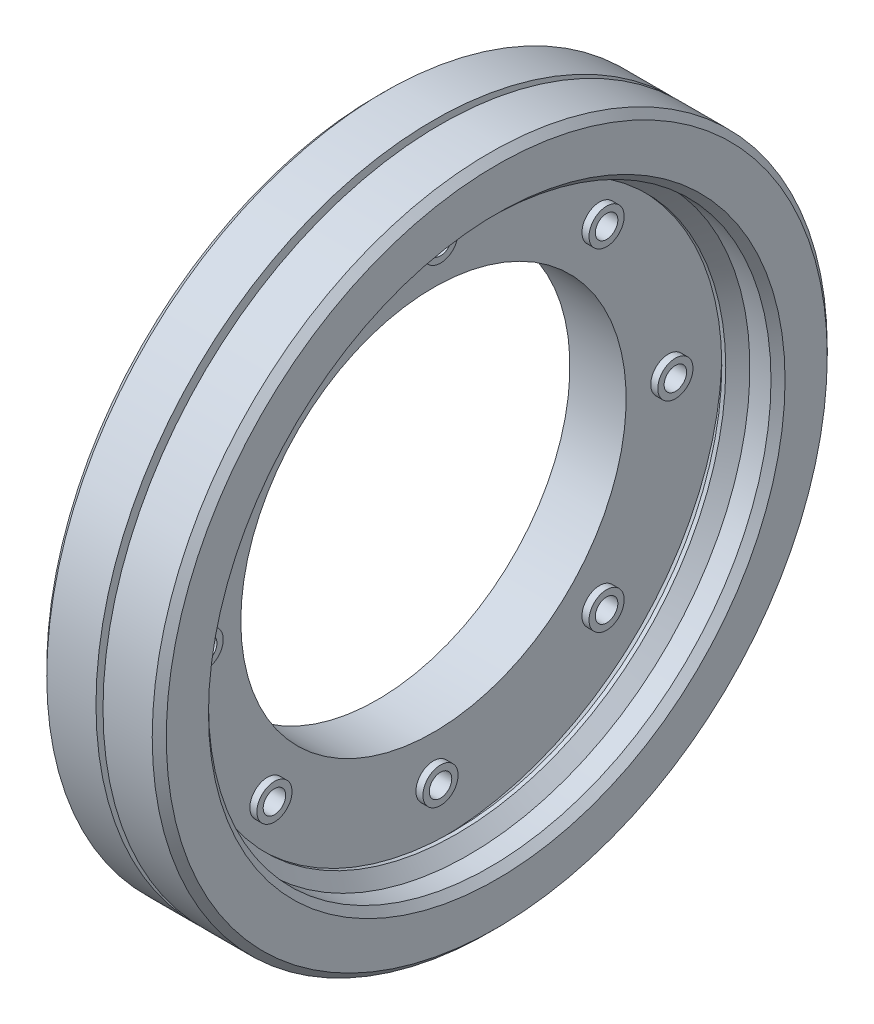
ISO-10303-21;
HEADER;
FILE_DESCRIPTION(('STEP AP214'),'2;1');
FILE_NAME('part.step','',(''),(''),'','','');
FILE_SCHEMA(('AUTOMOTIVE_DESIGN { 1 0 10303 214 1 1 1 1 }'));
ENDSEC;
DATA;
#1=APPLICATION_CONTEXT('core data for automotive mechanical design processes');
#2=APPLICATION_PROTOCOL_DEFINITION('international standard','automotive_design',2000,#1);
#3=PRODUCT_CONTEXT('',#1,'mechanical');
#4=PRODUCT('Part','Part','',(#3));
#5=PRODUCT_RELATED_PRODUCT_CATEGORY('part','',(#4));
#6=PRODUCT_DEFINITION_FORMATION('','',#4);
#7=PRODUCT_DEFINITION_CONTEXT('part definition',#1,'design');
#8=PRODUCT_DEFINITION('design','',#6,#7);
#9=PRODUCT_DEFINITION_SHAPE('','',#8);
#10=(LENGTH_UNIT() NAMED_UNIT(*) SI_UNIT(.MILLI.,.METRE.));
#11=(NAMED_UNIT(*) PLANE_ANGLE_UNIT() SI_UNIT($,.RADIAN.));
#12=(NAMED_UNIT(*) SI_UNIT($,.STERADIAN.) SOLID_ANGLE_UNIT());
#13=UNCERTAINTY_MEASURE_WITH_UNIT(LENGTH_MEASURE(1.E-05),#10,'distance_accuracy_value','');
#14=(GEOMETRIC_REPRESENTATION_CONTEXT(3) GLOBAL_UNCERTAINTY_ASSIGNED_CONTEXT((#13)) GLOBAL_UNIT_ASSIGNED_CONTEXT((#10,
#11,#12)) REPRESENTATION_CONTEXT('',''));
#15=CARTESIAN_POINT('',(0.,0.,0.));
#16=DIRECTION('',(0.,0.,1.));
#17=DIRECTION('',(1.,0.,0.));
#18=AXIS2_PLACEMENT_3D('',#15,#16,#17);
#19=CARTESIAN_POINT('',(-0.999999999999999,0.,0.));
#20=DIRECTION('',(1.,0.,0.));
#21=DIRECTION('',(0.,0.,-1.));
#22=AXIS2_PLACEMENT_3D('',#19,#20,#21);
#23=PLANE('',#22);
#24=CARTESIAN_POINT('',(-0.999999999999999,33.4,-3.49846430152082E-13));
#25=DIRECTION('',(1.,0.,0.));
#26=DIRECTION('',(0.,1.,0.));
#27=AXIS2_PLACEMENT_3D('',#24,#25,#26);
#28=CIRCLE('',#27,2.5);
#29=CARTESIAN_POINT('',(-0.999999999999999,35.9,-3.76032540193405E-13));
#30=VERTEX_POINT('',#29);
#31=EDGE_CURVE('E144',#30,#30,#28,.T.);
#32=ORIENTED_EDGE('',*,*,#31,.F.);
#33=EDGE_LOOP('',(#32));
#34=FACE_BOUND('',#33,.T.);
#35=CARTESIAN_POINT('',(-0.999999999999999,0.,33.4));
#36=DIRECTION('',(1.,0.,0.));
#37=DIRECTION('',(0.,0.,1.));
#38=AXIS2_PLACEMENT_3D('',#35,#36,#37);
#39=CIRCLE('',#38,2.5);
#40=CARTESIAN_POINT('',(-0.999999999999999,0.,35.9));
#41=VERTEX_POINT('',#40);
#42=EDGE_CURVE('E126',#41,#41,#39,.T.);
#43=ORIENTED_EDGE('',*,*,#42,.F.);
#44=EDGE_LOOP('',(#43));
#45=FACE_BOUND('',#44,.T.);
#46=CARTESIAN_POINT('',(-0.999999999999999,-33.4,1.16615476717361E-13));
#47=DIRECTION('',(1.,0.,0.));
#48=DIRECTION('',(0.,-1.,0.));
#49=AXIS2_PLACEMENT_3D('',#46,#47,#48);
#50=CIRCLE('',#49,2.5);
#51=CARTESIAN_POINT('',(-0.999999999999999,-35.9,1.25344180064468E-13));
#52=VERTEX_POINT('',#51);
#53=EDGE_CURVE('E108',#52,#52,#50,.T.);
#54=ORIENTED_EDGE('',*,*,#53,.F.);
#55=EDGE_LOOP('',(#54));
#56=FACE_BOUND('',#55,.T.);
#57=CARTESIAN_POINT('',(-0.999999999999999,0.,-33.4));
#58=DIRECTION('',(1.,0.,0.));
#59=DIRECTION('',(0.,0.,-1.));
#60=AXIS2_PLACEMENT_3D('',#57,#58,#59);
#61=CIRCLE('',#60,2.5);
#62=CARTESIAN_POINT('',(-0.999999999999999,0.,-35.9));
#63=VERTEX_POINT('',#62);
#64=EDGE_CURVE('E92',#63,#63,#61,.T.);
#65=ORIENTED_EDGE('',*,*,#64,.F.);
#66=EDGE_LOOP('',(#65));
#67=FACE_BOUND('',#66,.T.);
#68=CARTESIAN_POINT('',(-0.999999999999997,0.,0.));
#69=DIRECTION('',(-1.,0.,0.));
#70=DIRECTION('',(0.,0.,1.));
#71=AXIS2_PLACEMENT_3D('',#68,#69,#70);
#72=CIRCLE('',#71,27.4);
#73=CARTESIAN_POINT('',(-0.999999999999997,0.,27.4));
#74=VERTEX_POINT('',#73);
#75=EDGE_CURVE('E57',#74,#74,#72,.T.);
#76=ORIENTED_EDGE('',*,*,#75,.T.);
#77=EDGE_LOOP('',(#76));
#78=FACE_BOUND('',#77,.T.);
#79=CARTESIAN_POINT('',(-1.,0.,0.));
#80=DIRECTION('',(-1.,0.,0.));
#81=DIRECTION('',(0.,0.,1.));
#82=AXIS2_PLACEMENT_3D('',#79,#80,#81);
#83=CIRCLE('',#82,48.);
#84=CARTESIAN_POINT('',(-1.,0.,48.));
#85=VERTEX_POINT('',#84);
#86=EDGE_CURVE('E85',#85,#85,#83,.T.);
#87=ORIENTED_EDGE('',*,*,#86,.F.);
#88=EDGE_LOOP('',(#87));
#89=FACE_BOUND('',#88,.T.);
#90=CARTESIAN_POINT('',(-0.999999999999999,-23.6173664916307,-23.6173664916306));
#91=DIRECTION('',(1.,0.,0.));
#92=DIRECTION('',(0.,-0.707106781186549,-0.707106781186546));
#93=AXIS2_PLACEMENT_3D('',#90,#91,#92);
#94=CIRCLE('',#93,2.5);
#95=CARTESIAN_POINT('',(-0.999999999999999,-25.3851334445971,-25.385133444597));
#96=VERTEX_POINT('',#95);
#97=EDGE_CURVE('E99',#96,#96,#94,.T.);
#98=ORIENTED_EDGE('',*,*,#97,.F.);
#99=EDGE_LOOP('',(#98));
#100=FACE_BOUND('',#99,.T.);
#101=CARTESIAN_POINT('',(-0.999999999999999,-23.6173664916306,23.6173664916308));
#102=DIRECTION('',(1.,0.,0.));
#103=DIRECTION('',(0.,-0.707106781186544,0.707106781186551));
#104=AXIS2_PLACEMENT_3D('',#101,#102,#103);
#105=CIRCLE('',#104,2.5);
#106=CARTESIAN_POINT('',(-0.999999999999999,-25.3851334445969,25.3851334445972));
#107=VERTEX_POINT('',#106);
#108=EDGE_CURVE('E117',#107,#107,#105,.T.);
#109=ORIENTED_EDGE('',*,*,#108,.F.);
#110=EDGE_LOOP('',(#109));
#111=FACE_BOUND('',#110,.T.);
#112=CARTESIAN_POINT('',(-0.999999999999999,23.6173664916309,23.6173664916305));
#113=DIRECTION('',(1.,0.,0.));
#114=DIRECTION('',(0.,0.707106781186554,0.707106781186541));
#115=AXIS2_PLACEMENT_3D('',#112,#113,#114);
#116=CIRCLE('',#115,2.5);
#117=CARTESIAN_POINT('',(-0.999999999999999,25.3851334445973,25.3851334445968));
#118=VERTEX_POINT('',#117);
#119=EDGE_CURVE('E135',#118,#118,#116,.T.);
#120=ORIENTED_EDGE('',*,*,#119,.F.);
#121=EDGE_LOOP('',(#120));
#122=FACE_BOUND('',#121,.T.);
#123=CARTESIAN_POINT('',(-0.999999999999999,23.6173664916304,-23.617366491631));
#124=DIRECTION('',(1.,0.,0.));
#125=DIRECTION('',(0.,0.707106781186539,-0.707106781186556));
#126=AXIS2_PLACEMENT_3D('',#123,#124,#125);
#127=CIRCLE('',#126,2.5);
#128=CARTESIAN_POINT('',(-0.999999999999999,25.3851334445968,-25.3851334445974));
#129=VERTEX_POINT('',#128);
#130=EDGE_CURVE('E153',#129,#129,#127,.T.);
#131=ORIENTED_EDGE('',*,*,#130,.F.);
#132=EDGE_LOOP('',(#131));
#133=FACE_BOUND('',#132,.T.);
#134=ADVANCED_FACE('F42',(#34,#45,#56,#67,#78,#89,#100,#111,#122,#133),#23,.T.);
#135=CARTESIAN_POINT('',(0.,0.,0.));
#136=DIRECTION('',(-1.,0.,0.));
#137=DIRECTION('',(0.,0.,1.));
#138=AXIS2_PLACEMENT_3D('',#135,#136,#137);
#139=CYLINDRICAL_SURFACE('',#138,48.);
#140=CARTESIAN_POINT('',(-7.99999999999998,0.,0.));
#141=DIRECTION('',(1.,0.,0.));
#142=DIRECTION('',(0.,0.,-1.));
#143=AXIS2_PLACEMENT_3D('',#140,#141,#142);
#144=CIRCLE('',#143,48.);
#145=CARTESIAN_POINT('',(-7.99999999999998,0.,-48.));
#146=VERTEX_POINT('',#145);
#147=EDGE_CURVE('E11',#146,#146,#144,.T.);
#148=ORIENTED_EDGE('',*,*,#147,.T.);
#149=EDGE_LOOP('',(#148));
#150=FACE_BOUND('',#149,.T.);
#151=ORIENTED_EDGE('',*,*,#86,.T.);
#152=EDGE_LOOP('',(#151));
#153=FACE_BOUND('',#152,.T.);
#154=ADVANCED_FACE('F180',(#150,#153),#139,.T.);
#155=CARTESIAN_POINT('',(-9.,0.,0.));
#156=DIRECTION('',(1.,0.,0.));
#157=DIRECTION('',(0.,0.,-1.));
#158=AXIS2_PLACEMENT_3D('',#155,#156,#157);
#159=PLANE('',#158);
#160=CARTESIAN_POINT('',(-9.,0.,0.));
#161=DIRECTION('',(1.,0.,0.));
#162=DIRECTION('',(0.,0.,-1.));
#163=AXIS2_PLACEMENT_3D('',#160,#161,#162);
#164=CIRCLE('',#163,47.);
#165=CARTESIAN_POINT('',(-9.,0.,-47.));
#166=VERTEX_POINT('',#165);
#167=EDGE_CURVE('E49',#166,#166,#164,.F.);
#168=ORIENTED_EDGE('',*,*,#167,.T.);
#169=EDGE_LOOP('',(#168));
#170=FACE_BOUND('',#169,.T.);
#171=CARTESIAN_POINT('',(-9.,-33.4,1.16615476717361E-13));
#172=DIRECTION('',(1.,0.,0.));
#173=DIRECTION('',(0.,0.,-1.));
#174=AXIS2_PLACEMENT_3D('',#171,#172,#173);
#175=CIRCLE('',#174,1.6);
#176=CARTESIAN_POINT('',(-9.,-33.4,-1.59999999999988));
#177=VERTEX_POINT('',#176);
#178=EDGE_CURVE('E60',#177,#177,#175,.T.);
#179=ORIENTED_EDGE('',*,*,#178,.T.);
#180=EDGE_LOOP('',(#179));
#181=FACE_BOUND('',#180,.T.);
#182=CARTESIAN_POINT('',(-9.,-23.6173664916306,23.6173664916308));
#183=DIRECTION('',(1.,0.,0.));
#184=DIRECTION('',(0.,0.,-1.));
#185=AXIS2_PLACEMENT_3D('',#182,#183,#184);
#186=CIRCLE('',#185,1.6);
#187=CARTESIAN_POINT('',(-9.,-23.6173664916306,22.0173664916308));
#188=VERTEX_POINT('',#187);
#189=EDGE_CURVE('E64',#188,#188,#186,.T.);
#190=ORIENTED_EDGE('',*,*,#189,.T.);
#191=EDGE_LOOP('',(#190));
#192=FACE_BOUND('',#191,.T.);
#193=CARTESIAN_POINT('',(-9.,0.,33.4));
#194=DIRECTION('',(1.,0.,0.));
#195=DIRECTION('',(0.,0.,-1.));
#196=AXIS2_PLACEMENT_3D('',#193,#194,#195);
#197=CIRCLE('',#196,1.6);
#198=CARTESIAN_POINT('',(-9.,0.,31.8));
#199=VERTEX_POINT('',#198);
#200=EDGE_CURVE('E67',#199,#199,#197,.T.);
#201=ORIENTED_EDGE('',*,*,#200,.T.);
#202=EDGE_LOOP('',(#201));
#203=FACE_BOUND('',#202,.T.);
#204=CARTESIAN_POINT('',(-9.,23.6173664916309,23.6173664916305));
#205=DIRECTION('',(1.,0.,0.));
#206=DIRECTION('',(0.,0.,-1.));
#207=AXIS2_PLACEMENT_3D('',#204,#205,#206);
#208=CIRCLE('',#207,1.6);
#209=CARTESIAN_POINT('',(-9.,23.6173664916309,22.0173664916305));
#210=VERTEX_POINT('',#209);
#211=EDGE_CURVE('E70',#210,#210,#208,.T.);
#212=ORIENTED_EDGE('',*,*,#211,.T.);
#213=EDGE_LOOP('',(#212));
#214=FACE_BOUND('',#213,.T.);
#215=CARTESIAN_POINT('',(-9.,33.4,-3.49846430152082E-13));
#216=DIRECTION('',(1.,0.,0.));
#217=DIRECTION('',(0.,0.,-1.));
#218=AXIS2_PLACEMENT_3D('',#215,#216,#217);
#219=CIRCLE('',#218,1.6);
#220=CARTESIAN_POINT('',(-9.,33.4,-1.60000000000035));
#221=VERTEX_POINT('',#220);
#222=EDGE_CURVE('E73',#221,#221,#219,.T.);
#223=ORIENTED_EDGE('',*,*,#222,.T.);
#224=EDGE_LOOP('',(#223));
#225=FACE_BOUND('',#224,.T.);
#226=CARTESIAN_POINT('',(-9.,23.6173664916304,-23.617366491631));
#227=DIRECTION('',(1.,0.,0.));
#228=DIRECTION('',(0.,0.,-1.));
#229=AXIS2_PLACEMENT_3D('',#226,#227,#228);
#230=CIRCLE('',#229,1.6);
#231=CARTESIAN_POINT('',(-9.,23.6173664916304,-25.217366491631));
#232=VERTEX_POINT('',#231);
#233=EDGE_CURVE('E76',#232,#232,#230,.T.);
#234=ORIENTED_EDGE('',*,*,#233,.T.);
#235=EDGE_LOOP('',(#234));
#236=FACE_BOUND('',#235,.T.);
#237=CARTESIAN_POINT('',(-9.,-23.6173664916307,-23.6173664916306));
#238=DIRECTION('',(1.,0.,0.));
#239=DIRECTION('',(0.,0.,-1.));
#240=AXIS2_PLACEMENT_3D('',#237,#238,#239);
#241=CIRCLE('',#240,1.6);
#242=CARTESIAN_POINT('',(-9.,-23.6173664916307,-25.2173664916306));
#243=VERTEX_POINT('',#242);
#244=EDGE_CURVE('E79',#243,#243,#241,.T.);
#245=ORIENTED_EDGE('',*,*,#244,.T.);
#246=EDGE_LOOP('',(#245));
#247=FACE_BOUND('',#246,.T.);
#248=CARTESIAN_POINT('',(-9.,0.,-33.4));
#249=DIRECTION('',(1.,0.,0.));
#250=DIRECTION('',(0.,0.,-1.));
#251=AXIS2_PLACEMENT_3D('',#248,#249,#250);
#252=CIRCLE('',#251,1.6);
#253=CARTESIAN_POINT('',(-9.,0.,-35.));
#254=VERTEX_POINT('',#253);
#255=EDGE_CURVE('E88',#254,#254,#252,.T.);
#256=ORIENTED_EDGE('',*,*,#255,.T.);
#257=EDGE_LOOP('',(#256));
#258=FACE_BOUND('',#257,.T.);
#259=CARTESIAN_POINT('',(-9.,0.,0.));
#260=DIRECTION('',(-1.,0.,0.));
#261=DIRECTION('',(0.,0.,1.));
#262=AXIS2_PLACEMENT_3D('',#259,#260,#261);
#263=CIRCLE('',#262,27.4);
#264=CARTESIAN_POINT('',(-9.,0.,27.4));
#265=VERTEX_POINT('',#264);
#266=EDGE_CURVE('E53',#265,#265,#263,.T.);
#267=ORIENTED_EDGE('',*,*,#266,.F.);
#268=EDGE_LOOP('',(#267));
#269=FACE_BOUND('',#268,.T.);
#270=ADVANCED_FACE('F186',(#170,#181,#192,#203,#214,#225,#236,#247,#258,#269),#159,.F.);
#271=CARTESIAN_POINT('',(0.,0.,0.));
#272=DIRECTION('',(-1.,0.,0.));
#273=DIRECTION('',(0.,0.,1.));
#274=AXIS2_PLACEMENT_3D('',#271,#272,#273);
#275=CYLINDRICAL_SURFACE('',#274,27.4);
#276=ORIENTED_EDGE('',*,*,#266,.T.);
#277=EDGE_LOOP('',(#276));
#278=FACE_BOUND('',#277,.T.);
#279=ORIENTED_EDGE('',*,*,#75,.F.);
#280=EDGE_LOOP('',(#279));
#281=FACE_BOUND('',#280,.T.);
#282=ADVANCED_FACE('F193',(#278,#281),#275,.F.);
#283=CARTESIAN_POINT('',(-11.,0.,-33.4));
#284=DIRECTION('',(1.,0.,0.));
#285=DIRECTION('',(0.,0.,-1.));
#286=AXIS2_PLACEMENT_3D('',#283,#284,#285);
#287=CYLINDRICAL_SURFACE('',#286,1.6);
#288=ORIENTED_EDGE('',*,*,#255,.F.);
#289=EDGE_LOOP('',(#288));
#290=FACE_BOUND('',#289,.T.);
#291=CARTESIAN_POINT('',(0.,0.,-33.4));
#292=DIRECTION('',(1.,0.,0.));
#293=DIRECTION('',(0.,0.,-1.));
#294=AXIS2_PLACEMENT_3D('',#291,#292,#293);
#295=CIRCLE('',#294,1.6);
#296=CARTESIAN_POINT('',(0.,0.,-35.));
#297=VERTEX_POINT('',#296);
#298=EDGE_CURVE('E63',#297,#297,#295,.T.);
#299=ORIENTED_EDGE('',*,*,#298,.T.);
#300=EDGE_LOOP('',(#299));
#301=FACE_BOUND('',#300,.T.);
#302=ADVANCED_FACE('F191',(#290,#301),#287,.F.);
#303=CARTESIAN_POINT('',(0.,0.,-33.4));
#304=DIRECTION('',(1.,0.,0.));
#305=DIRECTION('',(0.,0.,-1.));
#306=AXIS2_PLACEMENT_3D('',#303,#304,#305);
#307=PLANE('',#306);
#308=CARTESIAN_POINT('',(0.,0.,-33.4));
#309=DIRECTION('',(1.,0.,0.));
#310=DIRECTION('',(0.,0.,-1.));
#311=AXIS2_PLACEMENT_3D('',#308,#309,#310);
#312=CIRCLE('',#311,2.5);
#313=CARTESIAN_POINT('',(0.,0.,-35.9));
#314=VERTEX_POINT('',#313);
#315=EDGE_CURVE('E91',#314,#314,#312,.T.);
#316=ORIENTED_EDGE('',*,*,#315,.T.);
#317=EDGE_LOOP('',(#316));
#318=FACE_BOUND('',#317,.T.);
#319=ORIENTED_EDGE('',*,*,#298,.F.);
#320=EDGE_LOOP('',(#319));
#321=FACE_BOUND('',#320,.T.);
#322=ADVANCED_FACE('F308',(#318,#321),#307,.T.);
#323=CARTESIAN_POINT('',(0.,0.,-33.4));
#324=DIRECTION('',(-1.,0.,0.));
#325=DIRECTION('',(0.,0.,1.));
#326=AXIS2_PLACEMENT_3D('',#323,#324,#325);
#327=CYLINDRICAL_SURFACE('',#326,2.5);
#328=ORIENTED_EDGE('',*,*,#315,.F.);
#329=EDGE_LOOP('',(#328));
#330=FACE_BOUND('',#329,.T.);
#331=ORIENTED_EDGE('',*,*,#64,.T.);
#332=EDGE_LOOP('',(#331));
#333=FACE_BOUND('',#332,.T.);
#334=ADVANCED_FACE('F306',(#330,#333),#327,.T.);
#335=CARTESIAN_POINT('',(-11.,-23.6173664916307,-23.6173664916306));
#336=DIRECTION('',(1.,0.,0.));
#337=DIRECTION('',(0.,0.,-1.));
#338=AXIS2_PLACEMENT_3D('',#335,#336,#337);
#339=CYLINDRICAL_SURFACE('',#338,1.6);
#340=ORIENTED_EDGE('',*,*,#244,.F.);
#341=EDGE_LOOP('',(#340));
#342=FACE_BOUND('',#341,.T.);
#343=CARTESIAN_POINT('',(0.,-23.6173664916307,-23.6173664916306));
#344=DIRECTION('',(1.,0.,0.));
#345=DIRECTION('',(0.,-0.707106781186549,-0.707106781186546));
#346=AXIS2_PLACEMENT_3D('',#343,#344,#345);
#347=CIRCLE('',#346,1.6);
#348=CARTESIAN_POINT('',(0.,-24.7487373415292,-24.7487373415291));
#349=VERTEX_POINT('',#348);
#350=EDGE_CURVE('E102',#349,#349,#347,.T.);
#351=ORIENTED_EDGE('',*,*,#350,.T.);
#352=EDGE_LOOP('',(#351));
#353=FACE_BOUND('',#352,.T.);
#354=ADVANCED_FACE('F288',(#342,#353),#339,.F.);
#355=CARTESIAN_POINT('',(-11.,23.6173664916304,-23.617366491631));
#356=DIRECTION('',(1.,0.,0.));
#357=DIRECTION('',(0.,0.,-1.));
#358=AXIS2_PLACEMENT_3D('',#355,#356,#357);
#359=CYLINDRICAL_SURFACE('',#358,1.6);
#360=ORIENTED_EDGE('',*,*,#233,.F.);
#361=EDGE_LOOP('',(#360));
#362=FACE_BOUND('',#361,.T.);
#363=CARTESIAN_POINT('',(0.,23.6173664916304,-23.617366491631));
#364=DIRECTION('',(1.,0.,0.));
#365=DIRECTION('',(0.,0.707106781186539,-0.707106781186556));
#366=AXIS2_PLACEMENT_3D('',#363,#364,#365);
#367=CIRCLE('',#366,1.6);
#368=CARTESIAN_POINT('',(0.,24.7487373415289,-24.7487373415295));
#369=VERTEX_POINT('',#368);
#370=EDGE_CURVE('E156',#369,#369,#367,.T.);
#371=ORIENTED_EDGE('',*,*,#370,.T.);
#372=EDGE_LOOP('',(#371));
#373=FACE_BOUND('',#372,.T.);
#374=ADVANCED_FACE('F162',(#362,#373),#359,.F.);
#375=CARTESIAN_POINT('',(-11.,33.4,-3.49846430152082E-13));
#376=DIRECTION('',(1.,0.,0.));
#377=DIRECTION('',(0.,0.,-1.));
#378=AXIS2_PLACEMENT_3D('',#375,#376,#377);
#379=CYLINDRICAL_SURFACE('',#378,1.6);
#380=ORIENTED_EDGE('',*,*,#222,.F.);
#381=EDGE_LOOP('',(#380));
#382=FACE_BOUND('',#381,.T.);
#383=CARTESIAN_POINT('',(0.,33.4,-3.49846430152082E-13));
#384=DIRECTION('',(1.,0.,0.));
#385=DIRECTION('',(0.,1.,0.));
#386=AXIS2_PLACEMENT_3D('',#383,#384,#385);
#387=CIRCLE('',#386,1.6);
#388=CARTESIAN_POINT('',(0.,35.,-3.66605540578529E-13));
#389=VERTEX_POINT('',#388);
#390=EDGE_CURVE('E147',#389,#389,#387,.T.);
#391=ORIENTED_EDGE('',*,*,#390,.T.);
#392=EDGE_LOOP('',(#391));
#393=FACE_BOUND('',#392,.T.);
#394=ADVANCED_FACE('F281',(#382,#393),#379,.F.);
#395=CARTESIAN_POINT('',(-11.,23.6173664916309,23.6173664916305));
#396=DIRECTION('',(1.,0.,0.));
#397=DIRECTION('',(0.,0.,-1.));
#398=AXIS2_PLACEMENT_3D('',#395,#396,#397);
#399=CYLINDRICAL_SURFACE('',#398,1.6);
#400=ORIENTED_EDGE('',*,*,#211,.F.);
#401=EDGE_LOOP('',(#400));
#402=FACE_BOUND('',#401,.T.);
#403=CARTESIAN_POINT('',(0.,23.6173664916309,23.6173664916305));
#404=DIRECTION('',(1.,0.,0.));
#405=DIRECTION('',(0.,0.707106781186554,0.707106781186541));
#406=AXIS2_PLACEMENT_3D('',#403,#404,#405);
#407=CIRCLE('',#406,1.6);
#408=CARTESIAN_POINT('',(0.,24.7487373415294,24.7487373415289));
#409=VERTEX_POINT('',#408);
#410=EDGE_CURVE('E138',#409,#409,#407,.T.);
#411=ORIENTED_EDGE('',*,*,#410,.T.);
#412=EDGE_LOOP('',(#411));
#413=FACE_BOUND('',#412,.T.);
#414=ADVANCED_FACE('F284',(#402,#413),#399,.F.);
#415=CARTESIAN_POINT('',(-11.,0.,33.4));
#416=DIRECTION('',(1.,0.,0.));
#417=DIRECTION('',(0.,0.,-1.));
#418=AXIS2_PLACEMENT_3D('',#415,#416,#417);
#419=CYLINDRICAL_SURFACE('',#418,1.6);
#420=ORIENTED_EDGE('',*,*,#200,.F.);
#421=EDGE_LOOP('',(#420));
#422=FACE_BOUND('',#421,.T.);
#423=CARTESIAN_POINT('',(0.,0.,33.4));
#424=DIRECTION('',(1.,0.,0.));
#425=DIRECTION('',(0.,0.,1.));
#426=AXIS2_PLACEMENT_3D('',#423,#424,#425);
#427=CIRCLE('',#426,1.6);
#428=CARTESIAN_POINT('',(0.,0.,35.));
#429=VERTEX_POINT('',#428);
#430=EDGE_CURVE('E129',#429,#429,#427,.T.);
#431=ORIENTED_EDGE('',*,*,#430,.T.);
#432=EDGE_LOOP('',(#431));
#433=FACE_BOUND('',#432,.T.);
#434=ADVANCED_FACE('F296',(#422,#433),#419,.F.);
#435=CARTESIAN_POINT('',(-11.,-23.6173664916306,23.6173664916308));
#436=DIRECTION('',(1.,0.,0.));
#437=DIRECTION('',(0.,0.,-1.));
#438=AXIS2_PLACEMENT_3D('',#435,#436,#437);
#439=CYLINDRICAL_SURFACE('',#438,1.6);
#440=ORIENTED_EDGE('',*,*,#189,.F.);
#441=EDGE_LOOP('',(#440));
#442=FACE_BOUND('',#441,.T.);
#443=CARTESIAN_POINT('',(0.,-23.6173664916306,23.6173664916308));
#444=DIRECTION('',(1.,0.,0.));
#445=DIRECTION('',(0.,-0.707106781186544,0.707106781186551));
#446=AXIS2_PLACEMENT_3D('',#443,#444,#445);
#447=CIRCLE('',#446,1.6);
#448=CARTESIAN_POINT('',(0.,-24.748737341529,24.7487373415293));
#449=VERTEX_POINT('',#448);
#450=EDGE_CURVE('E120',#449,#449,#447,.T.);
#451=ORIENTED_EDGE('',*,*,#450,.T.);
#452=EDGE_LOOP('',(#451));
#453=FACE_BOUND('',#452,.T.);
#454=ADVANCED_FACE('F292',(#442,#453),#439,.F.);
#455=CARTESIAN_POINT('',(-11.,-33.4,1.16615476717361E-13));
#456=DIRECTION('',(1.,0.,0.));
#457=DIRECTION('',(0.,0.,-1.));
#458=AXIS2_PLACEMENT_3D('',#455,#456,#457);
#459=CYLINDRICAL_SURFACE('',#458,1.6);
#460=ORIENTED_EDGE('',*,*,#178,.F.);
#461=EDGE_LOOP('',(#460));
#462=FACE_BOUND('',#461,.T.);
#463=CARTESIAN_POINT('',(0.,-33.4,1.16615476717361E-13));
#464=DIRECTION('',(1.,0.,0.));
#465=DIRECTION('',(0.,-1.,0.));
#466=AXIS2_PLACEMENT_3D('',#463,#464,#465);
#467=CIRCLE('',#466,1.6);
#468=CARTESIAN_POINT('',(0.,-35.,1.2220184685951E-13));
#469=VERTEX_POINT('',#468);
#470=EDGE_CURVE('E111',#469,#469,#467,.T.);
#471=ORIENTED_EDGE('',*,*,#470,.T.);
#472=EDGE_LOOP('',(#471));
#473=FACE_BOUND('',#472,.T.);
#474=ADVANCED_FACE('F276',(#462,#473),#459,.F.);
#475=CARTESIAN_POINT('',(0.,-23.6173664916307,-23.6173664916306));
#476=DIRECTION('',(1.,0.,0.));
#477=DIRECTION('',(0.,-0.707106781186549,-0.707106781186546));
#478=AXIS2_PLACEMENT_3D('',#475,#476,#477);
#479=PLANE('',#478);
#480=CARTESIAN_POINT('',(0.,-23.6173664916307,-23.6173664916306));
#481=DIRECTION('',(1.,0.,0.));
#482=DIRECTION('',(0.,-0.707106781186549,-0.707106781186546));
#483=AXIS2_PLACEMENT_3D('',#480,#481,#482);
#484=CIRCLE('',#483,2.5);
#485=CARTESIAN_POINT('',(0.,-25.3851334445971,-25.385133444597));
#486=VERTEX_POINT('',#485);
#487=EDGE_CURVE('E81',#486,#486,#484,.T.);
#488=ORIENTED_EDGE('',*,*,#487,.T.);
#489=EDGE_LOOP('',(#488));
#490=FACE_BOUND('',#489,.T.);
#491=ORIENTED_EDGE('',*,*,#350,.F.);
#492=EDGE_LOOP('',(#491));
#493=FACE_BOUND('',#492,.T.);
#494=ADVANCED_FACE('F273',(#490,#493),#479,.T.);
#495=CARTESIAN_POINT('',(0.,-23.6173664916307,-23.6173664916306));
#496=DIRECTION('',(-1.,0.,0.));
#497=DIRECTION('',(0.,0.,1.));
#498=AXIS2_PLACEMENT_3D('',#495,#496,#497);
#499=CYLINDRICAL_SURFACE('',#498,2.5);
#500=ORIENTED_EDGE('',*,*,#487,.F.);
#501=EDGE_LOOP('',(#500));
#502=FACE_BOUND('',#501,.T.);
#503=ORIENTED_EDGE('',*,*,#97,.T.);
#504=EDGE_LOOP('',(#503));
#505=FACE_BOUND('',#504,.T.);
#506=ADVANCED_FACE('F268',(#502,#505),#499,.T.);
#507=CARTESIAN_POINT('',(0.,-33.4,1.16615476717361E-13));
#508=DIRECTION('',(1.,0.,0.));
#509=DIRECTION('',(0.,-1.,0.));
#510=AXIS2_PLACEMENT_3D('',#507,#508,#509);
#511=PLANE('',#510);
#512=CARTESIAN_POINT('',(0.,-33.4,1.16615476717361E-13));
#513=DIRECTION('',(1.,0.,0.));
#514=DIRECTION('',(0.,-1.,0.));
#515=AXIS2_PLACEMENT_3D('',#512,#513,#514);
#516=CIRCLE('',#515,2.5);
#517=CARTESIAN_POINT('',(0.,-35.9,1.25344180064468E-13));
#518=VERTEX_POINT('',#517);
#519=EDGE_CURVE('E107',#518,#518,#516,.T.);
#520=ORIENTED_EDGE('',*,*,#519,.T.);
#521=EDGE_LOOP('',(#520));
#522=FACE_BOUND('',#521,.T.);
#523=ORIENTED_EDGE('',*,*,#470,.F.);
#524=EDGE_LOOP('',(#523));
#525=FACE_BOUND('',#524,.T.);
#526=ADVANCED_FACE('F265',(#522,#525),#511,.T.);
#527=CARTESIAN_POINT('',(0.,-33.4,1.16615476717361E-13));
#528=DIRECTION('',(-1.,0.,0.));
#529=DIRECTION('',(0.,0.,1.));
#530=AXIS2_PLACEMENT_3D('',#527,#528,#529);
#531=CYLINDRICAL_SURFACE('',#530,2.5);
#532=ORIENTED_EDGE('',*,*,#519,.F.);
#533=EDGE_LOOP('',(#532));
#534=FACE_BOUND('',#533,.T.);
#535=ORIENTED_EDGE('',*,*,#53,.T.);
#536=EDGE_LOOP('',(#535));
#537=FACE_BOUND('',#536,.T.);
#538=ADVANCED_FACE('F260',(#534,#537),#531,.T.);
#539=CARTESIAN_POINT('',(0.,-23.6173664916306,23.6173664916308));
#540=DIRECTION('',(1.,0.,0.));
#541=DIRECTION('',(0.,-0.707106781186544,0.707106781186551));
#542=AXIS2_PLACEMENT_3D('',#539,#540,#541);
#543=PLANE('',#542);
#544=CARTESIAN_POINT('',(0.,-23.6173664916306,23.6173664916308));
#545=DIRECTION('',(1.,0.,0.));
#546=DIRECTION('',(0.,-0.707106781186544,0.707106781186551));
#547=AXIS2_PLACEMENT_3D('',#544,#545,#546);
#548=CIRCLE('',#547,2.5);
#549=CARTESIAN_POINT('',(0.,-25.3851334445969,25.3851334445972));
#550=VERTEX_POINT('',#549);
#551=EDGE_CURVE('E116',#550,#550,#548,.T.);
#552=ORIENTED_EDGE('',*,*,#551,.T.);
#553=EDGE_LOOP('',(#552));
#554=FACE_BOUND('',#553,.T.);
#555=ORIENTED_EDGE('',*,*,#450,.F.);
#556=EDGE_LOOP('',(#555));
#557=FACE_BOUND('',#556,.T.);
#558=ADVANCED_FACE('F257',(#554,#557),#543,.T.);
#559=CARTESIAN_POINT('',(0.,-23.6173664916306,23.6173664916308));
#560=DIRECTION('',(-1.,0.,0.));
#561=DIRECTION('',(0.,0.,1.));
#562=AXIS2_PLACEMENT_3D('',#559,#560,#561);
#563=CYLINDRICAL_SURFACE('',#562,2.5);
#564=ORIENTED_EDGE('',*,*,#551,.F.);
#565=EDGE_LOOP('',(#564));
#566=FACE_BOUND('',#565,.T.);
#567=ORIENTED_EDGE('',*,*,#108,.T.);
#568=EDGE_LOOP('',(#567));
#569=FACE_BOUND('',#568,.T.);
#570=ADVANCED_FACE('F252',(#566,#569),#563,.T.);
#571=CARTESIAN_POINT('',(0.,0.,33.4));
#572=DIRECTION('',(1.,0.,0.));
#573=DIRECTION('',(0.,0.,1.));
#574=AXIS2_PLACEMENT_3D('',#571,#572,#573);
#575=PLANE('',#574);
#576=CARTESIAN_POINT('',(0.,0.,33.4));
#577=DIRECTION('',(1.,0.,0.));
#578=DIRECTION('',(0.,0.,1.));
#579=AXIS2_PLACEMENT_3D('',#576,#577,#578);
#580=CIRCLE('',#579,2.5);
#581=CARTESIAN_POINT('',(0.,0.,35.9));
#582=VERTEX_POINT('',#581);
#583=EDGE_CURVE('E125',#582,#582,#580,.T.);
#584=ORIENTED_EDGE('',*,*,#583,.T.);
#585=EDGE_LOOP('',(#584));
#586=FACE_BOUND('',#585,.T.);
#587=ORIENTED_EDGE('',*,*,#430,.F.);
#588=EDGE_LOOP('',(#587));
#589=FACE_BOUND('',#588,.T.);
#590=ADVANCED_FACE('F249',(#586,#589),#575,.T.);
#591=CARTESIAN_POINT('',(0.,0.,33.4));
#592=DIRECTION('',(-1.,0.,0.));
#593=DIRECTION('',(0.,0.,1.));
#594=AXIS2_PLACEMENT_3D('',#591,#592,#593);
#595=CYLINDRICAL_SURFACE('',#594,2.5);
#596=ORIENTED_EDGE('',*,*,#583,.F.);
#597=EDGE_LOOP('',(#596));
#598=FACE_BOUND('',#597,.T.);
#599=ORIENTED_EDGE('',*,*,#42,.T.);
#600=EDGE_LOOP('',(#599));
#601=FACE_BOUND('',#600,.T.);
#602=ADVANCED_FACE('F244',(#598,#601),#595,.T.);
#603=CARTESIAN_POINT('',(0.,23.6173664916309,23.6173664916305));
#604=DIRECTION('',(1.,0.,0.));
#605=DIRECTION('',(0.,0.707106781186554,0.707106781186541));
#606=AXIS2_PLACEMENT_3D('',#603,#604,#605);
#607=PLANE('',#606);
#608=CARTESIAN_POINT('',(0.,23.6173664916309,23.6173664916305));
#609=DIRECTION('',(1.,0.,0.));
#610=DIRECTION('',(0.,0.707106781186554,0.707106781186541));
#611=AXIS2_PLACEMENT_3D('',#608,#609,#610);
#612=CIRCLE('',#611,2.5);
#613=CARTESIAN_POINT('',(0.,25.3851334445973,25.3851334445968));
#614=VERTEX_POINT('',#613);
#615=EDGE_CURVE('E134',#614,#614,#612,.T.);
#616=ORIENTED_EDGE('',*,*,#615,.T.);
#617=EDGE_LOOP('',(#616));
#618=FACE_BOUND('',#617,.T.);
#619=ORIENTED_EDGE('',*,*,#410,.F.);
#620=EDGE_LOOP('',(#619));
#621=FACE_BOUND('',#620,.T.);
#622=ADVANCED_FACE('F235',(#618,#621),#607,.T.);
#623=CARTESIAN_POINT('',(0.,23.6173664916309,23.6173664916305));
#624=DIRECTION('',(-1.,0.,0.));
#625=DIRECTION('',(0.,0.,1.));
#626=AXIS2_PLACEMENT_3D('',#623,#624,#625);
#627=CYLINDRICAL_SURFACE('',#626,2.5);
#628=ORIENTED_EDGE('',*,*,#615,.F.);
#629=EDGE_LOOP('',(#628));
#630=FACE_BOUND('',#629,.T.);
#631=ORIENTED_EDGE('',*,*,#119,.T.);
#632=EDGE_LOOP('',(#631));
#633=FACE_BOUND('',#632,.T.);
#634=ADVANCED_FACE('F233',(#630,#633),#627,.T.);
#635=CARTESIAN_POINT('',(0.,33.4,-3.49846430152082E-13));
#636=DIRECTION('',(1.,0.,0.));
#637=DIRECTION('',(0.,1.,0.));
#638=AXIS2_PLACEMENT_3D('',#635,#636,#637);
#639=PLANE('',#638);
#640=CARTESIAN_POINT('',(0.,33.4,-3.49846430152082E-13));
#641=DIRECTION('',(1.,0.,0.));
#642=DIRECTION('',(0.,1.,0.));
#643=AXIS2_PLACEMENT_3D('',#640,#641,#642);
#644=CIRCLE('',#643,2.5);
#645=CARTESIAN_POINT('',(0.,35.9,-3.76032540193405E-13));
#646=VERTEX_POINT('',#645);
#647=EDGE_CURVE('E143',#646,#646,#644,.T.);
#648=ORIENTED_EDGE('',*,*,#647,.T.);
#649=EDGE_LOOP('',(#648));
#650=FACE_BOUND('',#649,.T.);
#651=ORIENTED_EDGE('',*,*,#390,.F.);
#652=EDGE_LOOP('',(#651));
#653=FACE_BOUND('',#652,.T.);
#654=ADVANCED_FACE('F176',(#650,#653),#639,.T.);
#655=CARTESIAN_POINT('',(0.,33.4,-3.49846430152082E-13));
#656=DIRECTION('',(-1.,0.,0.));
#657=DIRECTION('',(0.,0.,1.));
#658=AXIS2_PLACEMENT_3D('',#655,#656,#657);
#659=CYLINDRICAL_SURFACE('',#658,2.5);
#660=ORIENTED_EDGE('',*,*,#647,.F.);
#661=EDGE_LOOP('',(#660));
#662=FACE_BOUND('',#661,.T.);
#663=ORIENTED_EDGE('',*,*,#31,.T.);
#664=EDGE_LOOP('',(#663));
#665=FACE_BOUND('',#664,.T.);
#666=ADVANCED_FACE('F167',(#662,#665),#659,.T.);
#667=CARTESIAN_POINT('',(0.,23.6173664916304,-23.617366491631));
#668=DIRECTION('',(1.,0.,0.));
#669=DIRECTION('',(0.,0.707106781186539,-0.707106781186556));
#670=AXIS2_PLACEMENT_3D('',#667,#668,#669);
#671=PLANE('',#670);
#672=CARTESIAN_POINT('',(0.,23.6173664916304,-23.617366491631));
#673=DIRECTION('',(1.,0.,0.));
#674=DIRECTION('',(0.,0.707106781186539,-0.707106781186556));
#675=AXIS2_PLACEMENT_3D('',#672,#673,#674);
#676=CIRCLE('',#675,2.5);
#677=CARTESIAN_POINT('',(0.,25.3851334445968,-25.3851334445974));
#678=VERTEX_POINT('',#677);
#679=EDGE_CURVE('E152',#678,#678,#676,.T.);
#680=ORIENTED_EDGE('',*,*,#679,.T.);
#681=EDGE_LOOP('',(#680));
#682=FACE_BOUND('',#681,.T.);
#683=ORIENTED_EDGE('',*,*,#370,.F.);
#684=EDGE_LOOP('',(#683));
#685=FACE_BOUND('',#684,.T.);
#686=ADVANCED_FACE('F164',(#682,#685),#671,.T.);
#687=CARTESIAN_POINT('',(0.,23.6173664916304,-23.617366491631));
#688=DIRECTION('',(-1.,0.,0.));
#689=DIRECTION('',(0.,0.,1.));
#690=AXIS2_PLACEMENT_3D('',#687,#688,#689);
#691=CYLINDRICAL_SURFACE('',#690,2.5);
#692=ORIENTED_EDGE('',*,*,#679,.F.);
#693=EDGE_LOOP('',(#692));
#694=FACE_BOUND('',#693,.T.);
#695=ORIENTED_EDGE('',*,*,#130,.T.);
#696=EDGE_LOOP('',(#695));
#697=FACE_BOUND('',#696,.T.);
#698=ADVANCED_FACE('F166',(#694,#697),#691,.T.);
#699=CARTESIAN_POINT('',(-9.,0.,0.));
#700=DIRECTION('',(1.,0.,0.));
#701=DIRECTION('',(0.,0.,-1.));
#702=AXIS2_PLACEMENT_3D('',#699,#700,#701);
#703=CONICAL_SURFACE('',#702,47.,0.785398163397441);
#704=ORIENTED_EDGE('',*,*,#147,.F.);
#705=EDGE_LOOP('',(#704));
#706=FACE_BOUND('',#705,.T.);
#707=ORIENTED_EDGE('',*,*,#167,.F.);
#708=EDGE_LOOP('',(#707));
#709=FACE_BOUND('',#708,.T.);
#710=ADVANCED_FACE('F44',(#706,#709),#703,.T.);
#711=CLOSED_SHELL('',(#134,#154,#270,#282,#302,#322,#334,#354,#374,#394,#414,#434,#454,#474,
#494,#506,#526,#538,#558,#570,#590,#602,#622,#634,#654,#666,#686,#698,#710));
#712=MANIFOLD_SOLID_BREP('B2',#711);
#713=CARTESIAN_POINT('',(8.,0.,0.));
#714=DIRECTION('',(1.,0.,0.));
#715=DIRECTION('',(0.,0.,-1.));
#716=AXIS2_PLACEMENT_3D('',#713,#714,#715);
#717=PLANE('',#716);
#718=CARTESIAN_POINT('',(8.,0.,0.));
#719=DIRECTION('',(1.,0.,0.));
#720=DIRECTION('',(0.,0.,-1.));
#721=AXIS2_PLACEMENT_3D('',#718,#719,#720);
#722=CIRCLE('',#721,47.);
#723=CARTESIAN_POINT('',(8.,0.,-47.));
#724=VERTEX_POINT('',#723);
#725=EDGE_CURVE('E557',#724,#724,#722,.T.);
#726=ORIENTED_EDGE('',*,*,#725,.T.);
#727=EDGE_LOOP('',(#726));
#728=FACE_BOUND('',#727,.T.);
#729=CARTESIAN_POINT('',(8.,0.,0.));
#730=DIRECTION('',(1.,0.,0.));
#731=DIRECTION('',(0.,0.,-1.));
#732=AXIS2_PLACEMENT_3D('',#729,#730,#731);
#733=CIRCLE('',#732,41.);
#734=CARTESIAN_POINT('',(8.,0.,-41.));
#735=VERTEX_POINT('',#734);
#736=EDGE_CURVE('E561',#735,#735,#733,.F.);
#737=ORIENTED_EDGE('',*,*,#736,.T.);
#738=EDGE_LOOP('',(#737));
#739=FACE_BOUND('',#738,.T.);
#740=ADVANCED_FACE('F550',(#728,#739),#717,.T.);
#741=CARTESIAN_POINT('',(0.,0.,0.));
#742=DIRECTION('',(-1.,0.,0.));
#743=DIRECTION('',(0.,0.,1.));
#744=AXIS2_PLACEMENT_3D('',#741,#742,#743);
#745=CYLINDRICAL_SURFACE('',#744,48.);
#746=CARTESIAN_POINT('',(6.99999999999999,0.,0.));
#747=DIRECTION('',(1.,0.,0.));
#748=DIRECTION('',(0.,0.,-1.));
#749=AXIS2_PLACEMENT_3D('',#746,#747,#748);
#750=CIRCLE('',#749,48.);
#751=CARTESIAN_POINT('',(6.99999999999999,0.,-48.));
#752=VERTEX_POINT('',#751);
#753=EDGE_CURVE('E565',#752,#752,#750,.F.);
#754=ORIENTED_EDGE('',*,*,#753,.T.);
#755=EDGE_LOOP('',(#754));
#756=FACE_BOUND('',#755,.T.);
#757=CARTESIAN_POINT('',(0.,0.,0.));
#758=DIRECTION('',(-1.,0.,0.));
#759=DIRECTION('',(0.,0.,1.));
#760=AXIS2_PLACEMENT_3D('',#757,#758,#759);
#761=CIRCLE('',#760,48.);
#762=CARTESIAN_POINT('',(0.,0.,48.));
#763=VERTEX_POINT('',#762);
#764=EDGE_CURVE('E576',#763,#763,#761,.T.);
#765=ORIENTED_EDGE('',*,*,#764,.F.);
#766=EDGE_LOOP('',(#765));
#767=FACE_BOUND('',#766,.T.);
#768=ADVANCED_FACE('F603',(#756,#767),#745,.T.);
#769=CARTESIAN_POINT('',(0.,0.,0.));
#770=DIRECTION('',(1.,0.,0.));
#771=DIRECTION('',(0.,0.,-1.));
#772=AXIS2_PLACEMENT_3D('',#769,#770,#771);
#773=PLANE('',#772);
#774=CARTESIAN_POINT('',(0.,0.,0.));
#775=DIRECTION('',(-1.,0.,0.));
#776=DIRECTION('',(0.,0.,1.));
#777=AXIS2_PLACEMENT_3D('',#774,#775,#776);
#778=CIRCLE('',#777,40.);
#779=CARTESIAN_POINT('',(0.,0.,40.));
#780=VERTEX_POINT('',#779);
#781=EDGE_CURVE('E579',#780,#780,#778,.T.);
#782=ORIENTED_EDGE('',*,*,#781,.F.);
#783=EDGE_LOOP('',(#782));
#784=FACE_BOUND('',#783,.T.);
#785=ORIENTED_EDGE('',*,*,#764,.T.);
#786=EDGE_LOOP('',(#785));
#787=FACE_BOUND('',#786,.T.);
#788=ADVANCED_FACE('F599',(#784,#787),#773,.F.);
#789=CARTESIAN_POINT('',(0.,0.,0.));
#790=DIRECTION('',(-1.,0.,0.));
#791=DIRECTION('',(0.,0.,1.));
#792=AXIS2_PLACEMENT_3D('',#789,#790,#791);
#793=CONICAL_SURFACE('',#792,40.,0.78539816339745);
#794=CARTESIAN_POINT('',(1.71715728752537,0.,0.));
#795=DIRECTION('',(1.,0.,0.));
#796=DIRECTION('',(0.,0.,-1.));
#797=AXIS2_PLACEMENT_3D('',#794,#795,#796);
#798=CIRCLE('',#797,38.2828427124746);
#799=CARTESIAN_POINT('',(1.71715728752537,0.,-38.2828427124746));
#800=VERTEX_POINT('',#799);
#801=EDGE_CURVE('E570',#800,#800,#798,.T.);
#802=ORIENTED_EDGE('',*,*,#801,.T.);
#803=EDGE_LOOP('',(#802));
#804=FACE_BOUND('',#803,.T.);
#805=ORIENTED_EDGE('',*,*,#781,.T.);
#806=EDGE_LOOP('',(#805));
#807=FACE_BOUND('',#806,.T.);
#808=ADVANCED_FACE('F590',(#804,#807),#793,.F.);
#809=CARTESIAN_POINT('',(1.99999999999999,0.,0.));
#810=DIRECTION('',(1.,0.,0.));
#811=DIRECTION('',(0.,0.,-1.));
#812=AXIS2_PLACEMENT_3D('',#809,#810,#811);
#813=CONICAL_SURFACE('',#812,38.,0.785398163397444);
#814=CARTESIAN_POINT('',(2.28284271247461,0.,0.));
#815=DIRECTION('',(-1.,0.,0.));
#816=DIRECTION('',(0.,0.,1.));
#817=AXIS2_PLACEMENT_3D('',#814,#815,#816);
#818=CIRCLE('',#817,38.2828427124746);
#819=CARTESIAN_POINT('',(2.28284271247461,0.,38.2828427124746));
#820=VERTEX_POINT('',#819);
#821=EDGE_CURVE('E573',#820,#820,#818,.T.);
#822=ORIENTED_EDGE('',*,*,#821,.T.);
#823=EDGE_LOOP('',(#822));
#824=FACE_BOUND('',#823,.T.);
#825=CARTESIAN_POINT('',(4.00000000000001,0.,0.));
#826=DIRECTION('',(-1.,0.,0.));
#827=DIRECTION('',(0.,0.,1.));
#828=AXIS2_PLACEMENT_3D('',#825,#826,#827);
#829=CIRCLE('',#828,40.);
#830=CARTESIAN_POINT('',(4.00000000000001,0.,40.));
#831=VERTEX_POINT('',#830);
#832=EDGE_CURVE('E582',#831,#831,#829,.T.);
#833=ORIENTED_EDGE('',*,*,#832,.F.);
#834=EDGE_LOOP('',(#833));
#835=FACE_BOUND('',#834,.T.);
#836=ADVANCED_FACE('F588',(#824,#835),#813,.F.);
#837=CARTESIAN_POINT('',(0.,0.,0.));
#838=DIRECTION('',(-1.,0.,0.));
#839=DIRECTION('',(0.,0.,1.));
#840=AXIS2_PLACEMENT_3D('',#837,#838,#839);
#841=CYLINDRICAL_SURFACE('',#840,40.);
#842=CARTESIAN_POINT('',(6.99999999999999,0.,0.));
#843=DIRECTION('',(1.,0.,0.));
#844=DIRECTION('',(0.,0.,-1.));
#845=AXIS2_PLACEMENT_3D('',#842,#843,#844);
#846=CIRCLE('',#845,40.);
#847=CARTESIAN_POINT('',(6.99999999999999,0.,-40.));
#848=VERTEX_POINT('',#847);
#849=EDGE_CURVE('E41',#848,#848,#846,.T.);
#850=ORIENTED_EDGE('',*,*,#849,.T.);
#851=EDGE_LOOP('',(#850));
#852=FACE_BOUND('',#851,.T.);
#853=ORIENTED_EDGE('',*,*,#832,.T.);
#854=EDGE_LOOP('',(#853));
#855=FACE_BOUND('',#854,.T.);
#856=ADVANCED_FACE('F586',(#852,#855),#841,.F.);
#857=CARTESIAN_POINT('',(2.28284271247462,0.,0.));
#858=DIRECTION('',(-1.,0.,0.));
#859=DIRECTION('',(0.,0.,1.));
#860=AXIS2_PLACEMENT_3D('',#857,#858,#859);
#861=CYLINDRICAL_SURFACE('',#860,38.2828427124746);
#862=ORIENTED_EDGE('',*,*,#801,.F.);
#863=EDGE_LOOP('',(#862));
#864=FACE_BOUND('',#863,.T.);
#865=ORIENTED_EDGE('',*,*,#821,.F.);
#866=EDGE_LOOP('',(#865));
#867=FACE_BOUND('',#866,.T.);
#868=ADVANCED_FACE('F597',(#864,#867),#861,.F.);
#869=CARTESIAN_POINT('',(6.99999999999999,0.,0.));
#870=DIRECTION('',(-1.,0.,0.));
#871=DIRECTION('',(0.,0.,1.));
#872=AXIS2_PLACEMENT_3D('',#869,#870,#871);
#873=CONICAL_SURFACE('',#872,48.,0.785398163397448);
#874=ORIENTED_EDGE('',*,*,#725,.F.);
#875=EDGE_LOOP('',(#874));
#876=FACE_BOUND('',#875,.T.);
#877=ORIENTED_EDGE('',*,*,#753,.F.);
#878=EDGE_LOOP('',(#877));
#879=FACE_BOUND('',#878,.T.);
#880=ADVANCED_FACE('F614',(#876,#879),#873,.T.);
#881=CARTESIAN_POINT('',(8.,0.,0.));
#882=DIRECTION('',(1.,0.,0.));
#883=DIRECTION('',(0.,0.,-1.));
#884=AXIS2_PLACEMENT_3D('',#881,#882,#883);
#885=CONICAL_SURFACE('',#884,41.,0.785398163397448);
#886=ORIENTED_EDGE('',*,*,#849,.F.);
#887=EDGE_LOOP('',(#886));
#888=FACE_BOUND('',#887,.T.);
#889=ORIENTED_EDGE('',*,*,#736,.F.);
#890=EDGE_LOOP('',(#889));
#891=FACE_BOUND('',#890,.T.);
#892=ADVANCED_FACE('F552',(#888,#891),#885,.F.);
#893=CLOSED_SHELL('',(#740,#768,#788,#808,#836,#856,#868,#880,#892));
#894=MANIFOLD_SOLID_BREP('B6',#893);
#895=ADVANCED_BREP_SHAPE_REPRESENTATION('',(#18,#712,#894),#14);
#896=SHAPE_DEFINITION_REPRESENTATION(#9,#895);
ENDSEC;
END-ISO-10303-21;
